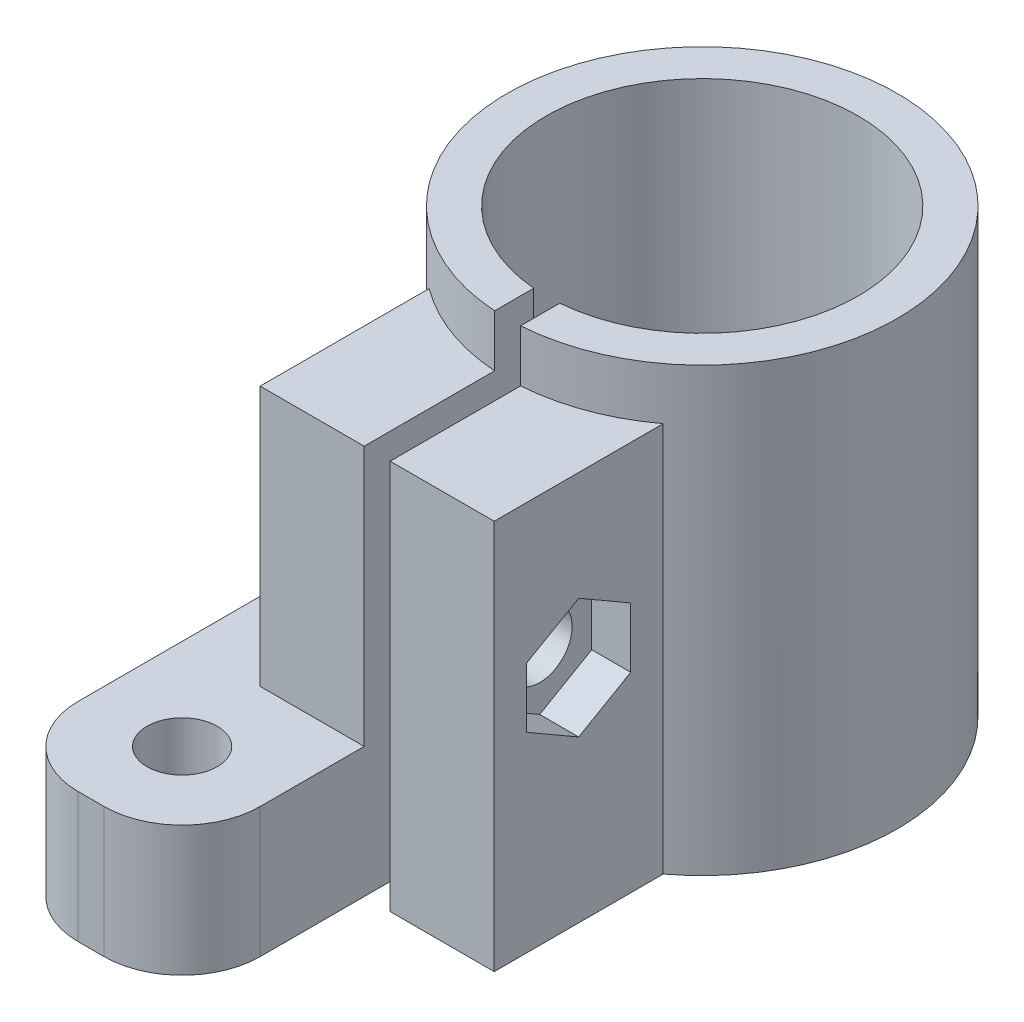
ISO-10303-21;
HEADER;
FILE_DESCRIPTION(('STEP AP214'),'2;1');
FILE_NAME('part.step','',(''),(''),'','','');
FILE_SCHEMA(('AUTOMOTIVE_DESIGN { 1 0 10303 214 1 1 1 1 }'));
ENDSEC;
DATA;
#1=APPLICATION_CONTEXT('core data for automotive mechanical design processes');
#2=APPLICATION_PROTOCOL_DEFINITION('international standard','automotive_design',2000,#1);
#3=PRODUCT_CONTEXT('',#1,'mechanical');
#4=PRODUCT('Part','Part','',(#3));
#5=PRODUCT_RELATED_PRODUCT_CATEGORY('part','',(#4));
#6=PRODUCT_DEFINITION_FORMATION('','',#4);
#7=PRODUCT_DEFINITION_CONTEXT('part definition',#1,'design');
#8=PRODUCT_DEFINITION('design','',#6,#7);
#9=PRODUCT_DEFINITION_SHAPE('','',#8);
#10=(LENGTH_UNIT() NAMED_UNIT(*) SI_UNIT(.MILLI.,.METRE.));
#11=(NAMED_UNIT(*) PLANE_ANGLE_UNIT() SI_UNIT($,.RADIAN.));
#12=(NAMED_UNIT(*) SI_UNIT($,.STERADIAN.) SOLID_ANGLE_UNIT());
#13=UNCERTAINTY_MEASURE_WITH_UNIT(LENGTH_MEASURE(1.E-05),#10,'distance_accuracy_value','');
#14=(GEOMETRIC_REPRESENTATION_CONTEXT(3) GLOBAL_UNCERTAINTY_ASSIGNED_CONTEXT((#13)) GLOBAL_UNIT_ASSIGNED_CONTEXT((#10,
#11,#12)) REPRESENTATION_CONTEXT('',''));
#15=CARTESIAN_POINT('',(0.,0.,0.));
#16=DIRECTION('',(0.,0.,1.));
#17=DIRECTION('',(1.,0.,0.));
#18=AXIS2_PLACEMENT_3D('',#15,#16,#17);
#19=CARTESIAN_POINT('',(-4.5,17.,-7.502));
#20=DIRECTION('',(-1.,0.,0.));
#21=DIRECTION('',(0.,-1.,0.));
#22=AXIS2_PLACEMENT_3D('',#19,#20,#21);
#23=PLANE('',#22);
#24=CARTESIAN_POINT('',(-4.5,8.5,9.25));
#25=DIRECTION('',(-1.,0.,0.));
#26=DIRECTION('',(0.,-1.,0.));
#27=AXIS2_PLACEMENT_3D('',#24,#25,#26);
#28=CIRCLE('',#27,1.25);
#29=CARTESIAN_POINT('',(-4.5,7.25,9.25));
#30=VERTEX_POINT('',#29);
#31=EDGE_CURVE('E274',#30,#30,#28,.T.);
#32=ORIENTED_EDGE('',*,*,#31,.F.);
#33=EDGE_LOOP('',(#32));
#34=FACE_BOUND('',#33,.T.);
#35=DIRECTION('',(0.,-1.,0.));
#36=VECTOR('',#35,1.);
#37=CARTESIAN_POINT('',(-4.5,17.,6.));
#38=LINE('',#37,#36);
#39=CARTESIAN_POINT('',(-4.5,15.,6.));
#40=VERTEX_POINT('',#39);
#41=CARTESIAN_POINT('',(-4.5,5.,6.));
#42=VERTEX_POINT('',#41);
#43=EDGE_CURVE('E313',#40,#42,#38,.T.);
#44=ORIENTED_EDGE('',*,*,#43,.T.);
#45=DIRECTION('',(0.,0.,-1.));
#46=VECTOR('',#45,1.);
#47=CARTESIAN_POINT('',(-4.5,5.,12.5));
#48=LINE('',#47,#46);
#49=CARTESIAN_POINT('',(-4.5,5.,12.5));
#50=VERTEX_POINT('',#49);
#51=EDGE_CURVE('E208',#50,#42,#48,.T.);
#52=ORIENTED_EDGE('',*,*,#51,.F.);
#53=DIRECTION('',(0.,-1.,0.));
#54=VECTOR('',#53,1.);
#55=CARTESIAN_POINT('',(-4.5,17.,12.5));
#56=LINE('',#55,#54);
#57=CARTESIAN_POINT('',(-4.5,15.,12.5));
#58=VERTEX_POINT('',#57);
#59=EDGE_CURVE('E202',#58,#50,#56,.T.);
#60=ORIENTED_EDGE('',*,*,#59,.F.);
#61=DIRECTION('',(0.,0.,1.));
#62=VECTOR('',#61,1.);
#63=CARTESIAN_POINT('',(-4.5,15.,6.));
#64=LINE('',#63,#62);
#65=EDGE_CURVE('E285',#40,#58,#64,.T.);
#66=ORIENTED_EDGE('',*,*,#65,.F.);
#67=EDGE_LOOP('',(#44,#52,#60,#66));
#68=FACE_BOUND('',#67,.T.);
#69=ADVANCED_FACE('F37',(#34,#68),#23,.T.);
#70=CARTESIAN_POINT('',(0.,0.,12.5));
#71=DIRECTION('',(0.,0.,-1.));
#72=DIRECTION('',(-1.,0.,0.));
#73=AXIS2_PLACEMENT_3D('',#70,#71,#72);
#74=PLANE('',#73);
#75=DIRECTION('',(-1.,0.,0.));
#76=VECTOR('',#75,1.);
#77=CARTESIAN_POINT('',(-0.5,5.,12.5));
#78=LINE('',#77,#76);
#79=CARTESIAN_POINT('',(-0.5,5.,12.5));
#80=VERTEX_POINT('',#79);
#81=EDGE_CURVE('E187',#80,#50,#78,.T.);
#82=ORIENTED_EDGE('',*,*,#81,.F.);
#83=DIRECTION('',(0.,1.,0.));
#84=VECTOR('',#83,1.);
#85=CARTESIAN_POINT('',(-0.5,17.,12.5));
#86=LINE('',#85,#84);
#87=CARTESIAN_POINT('',(-0.5,15.,12.5));
#88=VERTEX_POINT('',#87);
#89=EDGE_CURVE('E195',#80,#88,#86,.T.);
#90=ORIENTED_EDGE('',*,*,#89,.T.);
#91=DIRECTION('',(1.,0.,0.));
#92=VECTOR('',#91,1.);
#93=CARTESIAN_POINT('',(-4.5,15.,12.5));
#94=LINE('',#93,#92);
#95=EDGE_CURVE('E287',#58,#88,#94,.T.);
#96=ORIENTED_EDGE('',*,*,#95,.F.);
#97=ORIENTED_EDGE('',*,*,#59,.T.);
#98=EDGE_LOOP('',(#82,#90,#96,#97));
#99=FACE_BOUND('',#98,.T.);
#100=ADVANCED_FACE('F206',(#99),#74,.F.);
#101=CARTESIAN_POINT('',(0.,17.,0.));
#102=DIRECTION('',(0.,-1.,0.));
#103=DIRECTION('',(0.,0.,-1.));
#104=AXIS2_PLACEMENT_3D('',#101,#102,#103);
#105=CYLINDRICAL_SURFACE('',#104,7.5);
#106=DIRECTION('',(0.,-1.,0.));
#107=VECTOR('',#106,1.);
#108=CARTESIAN_POINT('',(-7.5,5.,0.));
#109=LINE('',#108,#107);
#110=CARTESIAN_POINT('',(-7.5,5.,0.));
#111=VERTEX_POINT('',#110);
#112=CARTESIAN_POINT('',(-7.5,0.,0.));
#113=VERTEX_POINT('',#112);
#114=EDGE_CURVE('E210',#111,#113,#109,.T.);
#115=ORIENTED_EDGE('',*,*,#114,.F.);
#116=CARTESIAN_POINT('',(0.,5.,0.));
#117=DIRECTION('',(0.,-1.,0.));
#118=DIRECTION('',(0.,0.,-1.));
#119=AXIS2_PLACEMENT_3D('',#116,#117,#118);
#120=CIRCLE('',#119,7.5);
#121=EDGE_CURVE('E222',#42,#111,#120,.T.);
#122=ORIENTED_EDGE('',*,*,#121,.F.);
#123=ORIENTED_EDGE('',*,*,#43,.F.);
#124=CARTESIAN_POINT('',(0.,15.,0.));
#125=DIRECTION('',(0.,-1.,0.));
#126=DIRECTION('',(0.,0.,1.));
#127=AXIS2_PLACEMENT_3D('',#124,#125,#126);
#128=CIRCLE('',#127,7.5);
#129=CARTESIAN_POINT('',(-0.5,15.,7.48331477354788));
#130=VERTEX_POINT('',#129);
#131=EDGE_CURVE('E281',#130,#40,#128,.T.);
#132=ORIENTED_EDGE('',*,*,#131,.F.);
#133=DIRECTION('',(0.,1.,0.));
#134=VECTOR('',#133,1.);
#135=CARTESIAN_POINT('',(-0.5,15.,7.48331477354788));
#136=LINE('',#135,#134);
#137=CARTESIAN_POINT('',(-0.5,17.,7.48331477354788));
#138=VERTEX_POINT('',#137);
#139=EDGE_CURVE('E295',#138,#130,#136,.F.);
#140=ORIENTED_EDGE('',*,*,#139,.F.);
#141=CARTESIAN_POINT('',(0.,17.,0.));
#142=DIRECTION('',(0.,1.,0.));
#143=DIRECTION('',(0.,0.,1.));
#144=AXIS2_PLACEMENT_3D('',#141,#142,#143);
#145=CIRCLE('',#144,7.5);
#146=CARTESIAN_POINT('',(0.5,17.,7.48331477354788));
#147=VERTEX_POINT('',#146);
#148=EDGE_CURVE('E341',#147,#138,#145,.T.);
#149=ORIENTED_EDGE('',*,*,#148,.F.);
#150=DIRECTION('',(0.,1.,0.));
#151=VECTOR('',#150,1.);
#152=CARTESIAN_POINT('',(0.5,15.,7.48331477354788));
#153=LINE('',#152,#151);
#154=CARTESIAN_POINT('',(0.5,15.,7.48331477354788));
#155=VERTEX_POINT('',#154);
#156=EDGE_CURVE('E297',#155,#147,#153,.T.);
#157=ORIENTED_EDGE('',*,*,#156,.F.);
#158=CARTESIAN_POINT('',(4.5,15.,6.));
#159=VERTEX_POINT('',#158);
#160=EDGE_CURVE('E282',#159,#155,#128,.T.);
#161=ORIENTED_EDGE('',*,*,#160,.F.);
#162=DIRECTION('',(0.,-1.,0.));
#163=VECTOR('',#162,1.);
#164=CARTESIAN_POINT('',(4.5,17.,6.));
#165=LINE('',#164,#163);
#166=CARTESIAN_POINT('',(4.5,0.,6.));
#167=VERTEX_POINT('',#166);
#168=EDGE_CURVE('E308',#167,#159,#165,.F.);
#169=ORIENTED_EDGE('',*,*,#168,.F.);
#170=CARTESIAN_POINT('',(0.,0.,0.));
#171=DIRECTION('',(0.,1.,0.));
#172=DIRECTION('',(0.,0.,1.));
#173=AXIS2_PLACEMENT_3D('',#170,#171,#172);
#174=CIRCLE('',#173,7.5);
#175=EDGE_CURVE('E338',#167,#113,#174,.T.);
#176=ORIENTED_EDGE('',*,*,#175,.T.);
#177=EDGE_LOOP('',(#115,#122,#123,#132,#140,#149,#157,#161,#169,#176));
#178=FACE_BOUND('',#177,.T.);
#179=ADVANCED_FACE('F373',(#178),#105,.T.);
#180=CARTESIAN_POINT('',(8.03553390593273,8.5,9.25));
#181=DIRECTION('',(-1.,0.,0.));
#182=DIRECTION('',(0.,-1.,0.));
#183=AXIS2_PLACEMENT_3D('',#180,#181,#182);
#184=CYLINDRICAL_SURFACE('',#183,1.25);
#185=CARTESIAN_POINT('',(0.5,8.5,9.25));
#186=DIRECTION('',(1.,0.,0.));
#187=DIRECTION('',(0.,0.,-1.));
#188=AXIS2_PLACEMENT_3D('',#185,#186,#187);
#189=CIRCLE('',#188,1.25);
#190=CARTESIAN_POINT('',(0.5,7.25,9.25));
#191=VERTEX_POINT('',#190);
#192=EDGE_CURVE('E278',#191,#191,#189,.T.);
#193=CARTESIAN_POINT('',(3.,8.5,9.25));
#194=DIRECTION('',(1.,0.,0.));
#195=DIRECTION('',(0.,0.,-1.));
#196=AXIS2_PLACEMENT_3D('',#193,#194,#195);
#197=CIRCLE('',#196,1.25);
#198=CARTESIAN_POINT('',(3.,7.25,9.25));
#199=VERTEX_POINT('',#198);
#200=EDGE_CURVE('E263',#199,#199,#197,.F.);
#201=CARTESIAN_POINT('',(0.5,7.25,9.25));
#202=CARTESIAN_POINT('',(0.526041666666666,7.25,9.25));
#203=CARTESIAN_POINT('',(0.552083333333333,7.25,9.25));
#204=CARTESIAN_POINT('',(0.604166666666666,7.25,9.25));
#205=CARTESIAN_POINT('',(0.630208333333333,7.25,9.25));
#206=CARTESIAN_POINT('',(0.682291666666666,7.25,9.25));
#207=CARTESIAN_POINT('',(0.708333333333333,7.25,9.25));
#208=CARTESIAN_POINT('',(0.760416666666667,7.25,9.25));
#209=CARTESIAN_POINT('',(0.786458333333333,7.25,9.25));
#210=CARTESIAN_POINT('',(0.838541666666667,7.25,9.25));
#211=CARTESIAN_POINT('',(0.864583333333333,7.25,9.25));
#212=CARTESIAN_POINT('',(0.916666666666667,7.25,9.25));
#213=CARTESIAN_POINT('',(0.942708333333333,7.25,9.25));
#214=CARTESIAN_POINT('',(0.994791666666667,7.25,9.25));
#215=CARTESIAN_POINT('',(1.02083333333333,7.25,9.25));
#216=CARTESIAN_POINT('',(1.07291666666667,7.25,9.25));
#217=CARTESIAN_POINT('',(1.09895833333333,7.25,9.25));
#218=CARTESIAN_POINT('',(1.15104166666667,7.25,9.25));
#219=CARTESIAN_POINT('',(1.17708333333333,7.25,9.25));
#220=CARTESIAN_POINT('',(1.22916666666667,7.25,9.25));
#221=CARTESIAN_POINT('',(1.25520833333333,7.25,9.25));
#222=CARTESIAN_POINT('',(1.30729166666667,7.25,9.25));
#223=CARTESIAN_POINT('',(1.33333333333333,7.25,9.25));
#224=CARTESIAN_POINT('',(1.38541666666667,7.25,9.25));
#225=CARTESIAN_POINT('',(1.41145833333333,7.25,9.25));
#226=CARTESIAN_POINT('',(1.46354166666667,7.25,9.25));
#227=CARTESIAN_POINT('',(1.48958333333333,7.25,9.25));
#228=CARTESIAN_POINT('',(1.54166666666667,7.25,9.25));
#229=CARTESIAN_POINT('',(1.56770833333333,7.25,9.25));
#230=CARTESIAN_POINT('',(1.61979166666667,7.25,9.25));
#231=CARTESIAN_POINT('',(1.64583333333333,7.25,9.25));
#232=CARTESIAN_POINT('',(1.69791666666667,7.25,9.25));
#233=CARTESIAN_POINT('',(1.72395833333333,7.25,9.25));
#234=CARTESIAN_POINT('',(1.77604166666667,7.25,9.25));
#235=CARTESIAN_POINT('',(1.80208333333333,7.25,9.25));
#236=CARTESIAN_POINT('',(1.85416666666667,7.25,9.25));
#237=CARTESIAN_POINT('',(1.88020833333333,7.25,9.25));
#238=CARTESIAN_POINT('',(1.93229166666667,7.25,9.25));
#239=CARTESIAN_POINT('',(1.95833333333333,7.25,9.25));
#240=CARTESIAN_POINT('',(2.01041666666667,7.25,9.25));
#241=CARTESIAN_POINT('',(2.03645833333333,7.25,9.25));
#242=CARTESIAN_POINT('',(2.08854166666667,7.25,9.25));
#243=CARTESIAN_POINT('',(2.11458333333333,7.25,9.25));
#244=CARTESIAN_POINT('',(2.16666666666667,7.25,9.25));
#245=CARTESIAN_POINT('',(2.19270833333333,7.25,9.25));
#246=CARTESIAN_POINT('',(2.24479166666667,7.25,9.25));
#247=CARTESIAN_POINT('',(2.27083333333333,7.25,9.25));
#248=CARTESIAN_POINT('',(2.32291666666667,7.25,9.25));
#249=CARTESIAN_POINT('',(2.34895833333333,7.25,9.25));
#250=CARTESIAN_POINT('',(2.40104166666667,7.25,9.25));
#251=CARTESIAN_POINT('',(2.42708333333333,7.25,9.25));
#252=CARTESIAN_POINT('',(2.47916666666667,7.25,9.25));
#253=CARTESIAN_POINT('',(2.50520833333333,7.25,9.25));
#254=CARTESIAN_POINT('',(2.55729166666667,7.25,9.25));
#255=CARTESIAN_POINT('',(2.58333333333333,7.25,9.25));
#256=CARTESIAN_POINT('',(2.63541666666667,7.25,9.25));
#257=CARTESIAN_POINT('',(2.66145833333333,7.25,9.25));
#258=CARTESIAN_POINT('',(2.71354166666667,7.25,9.25));
#259=CARTESIAN_POINT('',(2.73958333333333,7.25,9.25));
#260=CARTESIAN_POINT('',(2.79166666666667,7.25,9.25));
#261=CARTESIAN_POINT('',(2.81770833333333,7.25,9.25));
#262=CARTESIAN_POINT('',(2.86979166666667,7.25,9.25));
#263=CARTESIAN_POINT('',(2.89583333333333,7.25,9.25));
#264=CARTESIAN_POINT('',(2.94791666666667,7.25,9.25));
#265=CARTESIAN_POINT('',(2.97395833333333,7.25,9.25));
#266=CARTESIAN_POINT('',(3.,7.25,9.25));
#267=B_SPLINE_CURVE_WITH_KNOTS('',3,(#201,#202,#203,#204,#205,#206,#207,#208,#209,#210,#211,
#212,#213,#214,#215,#216,#217,#218,#219,#220,#221,#222,#223,#224,#225,#226,#227,#228,#229,#230,
#231,#232,#233,#234,#235,#236,#237,#238,#239,#240,#241,#242,#243,#244,#245,#246,#247,#248,#249,
#250,#251,#252,#253,#254,#255,#256,#257,#258,#259,#260,#261,#262,#263,#264,#265,#266),
.UNSPECIFIED.,.F.,.F.,(4,2,2,2,2,2,2,2,2,2,2,2,2,2,2,2,2,2,2,2,2,2,2,2,2,2,2,2,2,2,2,2,4),(0.,
0.0781250000000001,0.15625,0.234375,0.3125,0.390625,0.46875,0.546875,0.625000000000001,
0.703125000000001,0.78125,0.859375,0.9375,1.015625,1.09375,1.171875,1.25,1.328125,1.40625,
1.484375,1.5625,1.640625,1.71875,1.796875,1.875,1.953125,2.03125,2.109375,2.1875,2.265625,
2.34375,2.421875,2.5),.UNSPECIFIED.);
#268=EDGE_CURVE('BSEAM435',#191,#199,#267,.T.);
#269=ORIENTED_EDGE('',*,*,#192,.F.);
#270=ORIENTED_EDGE('',*,*,#200,.F.);
#271=ORIENTED_EDGE('',*,*,#268,.T.);
#272=ORIENTED_EDGE('',*,*,#268,.F.);
#273=EDGE_LOOP('',(#269,#271,#270,#272));
#274=FACE_BOUND('',#273,.T.);
#275=ADVANCED_FACE('F435',(#274),#184,.F.);
#276=CARTESIAN_POINT('',(4.5,17.,-7.502));
#277=DIRECTION('',(1.,0.,0.));
#278=DIRECTION('',(0.,1.,0.));
#279=AXIS2_PLACEMENT_3D('',#276,#277,#278);
#280=PLANE('',#279);
#281=DIRECTION('',(0.,-0.5,-0.866025403784439));
#282=VECTOR('',#281,1.);
#283=CARTESIAN_POINT('',(4.5,7.34529946162075,11.25));
#284=LINE('',#283,#282);
#285=CARTESIAN_POINT('',(4.5,7.34529946162075,11.25));
#286=VERTEX_POINT('',#285);
#287=CARTESIAN_POINT('',(4.5,6.1905989232415,9.25));
#288=VERTEX_POINT('',#287);
#289=EDGE_CURVE('E225',#286,#288,#284,.T.);
#290=ORIENTED_EDGE('',*,*,#289,.F.);
#291=DIRECTION('',(0.,-1.,0.));
#292=VECTOR('',#291,1.);
#293=CARTESIAN_POINT('',(4.5,9.65470053837926,11.25));
#294=LINE('',#293,#292);
#295=CARTESIAN_POINT('',(4.5,9.65470053837926,11.25));
#296=VERTEX_POINT('',#295);
#297=EDGE_CURVE('E230',#296,#286,#294,.T.);
#298=ORIENTED_EDGE('',*,*,#297,.F.);
#299=DIRECTION('',(0.,-0.5,0.866025403784438));
#300=VECTOR('',#299,1.);
#301=CARTESIAN_POINT('',(4.5,10.8094010767585,9.25));
#302=LINE('',#301,#300);
#303=CARTESIAN_POINT('',(4.5,10.8094010767585,9.25));
#304=VERTEX_POINT('',#303);
#305=EDGE_CURVE('E256',#304,#296,#302,.T.);
#306=ORIENTED_EDGE('',*,*,#305,.F.);
#307=DIRECTION('',(0.,0.499999999999999,0.866025403784439));
#308=VECTOR('',#307,1.);
#309=CARTESIAN_POINT('',(4.5,9.65470053837926,7.25));
#310=LINE('',#309,#308);
#311=CARTESIAN_POINT('',(4.5,9.65470053837926,7.25));
#312=VERTEX_POINT('',#311);
#313=EDGE_CURVE('E253',#312,#304,#310,.T.);
#314=ORIENTED_EDGE('',*,*,#313,.F.);
#315=DIRECTION('',(0.,1.,0.));
#316=VECTOR('',#315,1.);
#317=CARTESIAN_POINT('',(4.5,7.34529946162075,7.25));
#318=LINE('',#317,#316);
#319=CARTESIAN_POINT('',(4.5,7.34529946162075,7.25));
#320=VERTEX_POINT('',#319);
#321=EDGE_CURVE('E250',#320,#312,#318,.T.);
#322=ORIENTED_EDGE('',*,*,#321,.F.);
#323=DIRECTION('',(0.,0.5,-0.866025403784438));
#324=VECTOR('',#323,1.);
#325=CARTESIAN_POINT('',(4.5,6.1905989232415,9.25));
#326=LINE('',#325,#324);
#327=EDGE_CURVE('E247',#288,#320,#326,.T.);
#328=ORIENTED_EDGE('',*,*,#327,.F.);
#329=EDGE_LOOP('',(#290,#298,#306,#314,#322,#328));
#330=FACE_BOUND('',#329,.T.);
#331=ORIENTED_EDGE('',*,*,#168,.T.);
#332=DIRECTION('',(0.,0.,-1.));
#333=VECTOR('',#332,1.);
#334=CARTESIAN_POINT('',(4.5,15.,12.5));
#335=LINE('',#334,#333);
#336=CARTESIAN_POINT('',(4.5,15.,12.5));
#337=VERTEX_POINT('',#336);
#338=EDGE_CURVE('E289',#337,#159,#335,.T.);
#339=ORIENTED_EDGE('',*,*,#338,.F.);
#340=DIRECTION('',(0.,1.,0.));
#341=VECTOR('',#340,1.);
#342=CARTESIAN_POINT('',(4.5,17.,12.5));
#343=LINE('',#342,#341);
#344=CARTESIAN_POINT('',(4.5,0.,12.5));
#345=VERTEX_POINT('',#344);
#346=EDGE_CURVE('E305',#345,#337,#343,.T.);
#347=ORIENTED_EDGE('',*,*,#346,.F.);
#348=DIRECTION('',(0.,0.,1.));
#349=VECTOR('',#348,1.);
#350=CARTESIAN_POINT('',(4.5,0.,-7.502));
#351=LINE('',#350,#349);
#352=EDGE_CURVE('E203',#167,#345,#351,.T.);
#353=ORIENTED_EDGE('',*,*,#352,.F.);
#354=EDGE_LOOP('',(#331,#339,#347,#353));
#355=FACE_BOUND('',#354,.T.);
#356=ADVANCED_FACE('F399',(#330,#355),#280,.T.);
#357=CARTESIAN_POINT('',(0.,0.,12.5));
#358=DIRECTION('',(0.,0.,1.));
#359=DIRECTION('',(1.,0.,0.));
#360=AXIS2_PLACEMENT_3D('',#357,#358,#359);
#361=PLANE('',#360);
#362=ORIENTED_EDGE('',*,*,#346,.T.);
#363=DIRECTION('',(-1.,0.,0.));
#364=VECTOR('',#363,1.);
#365=CARTESIAN_POINT('',(0.,15.,12.5));
#366=LINE('',#365,#364);
#367=CARTESIAN_POINT('',(0.5,15.,12.5));
#368=VERTEX_POINT('',#367);
#369=EDGE_CURVE('E343',#337,#368,#366,.T.);
#370=ORIENTED_EDGE('',*,*,#369,.T.);
#371=DIRECTION('',(0.,-1.,0.));
#372=VECTOR('',#371,1.);
#373=CARTESIAN_POINT('',(0.5,17.,12.5));
#374=LINE('',#373,#372);
#375=CARTESIAN_POINT('',(0.5,0.,12.5));
#376=VERTEX_POINT('',#375);
#377=EDGE_CURVE('E300',#368,#376,#374,.T.);
#378=ORIENTED_EDGE('',*,*,#377,.T.);
#379=DIRECTION('',(1.,0.,0.));
#380=VECTOR('',#379,1.);
#381=CARTESIAN_POINT('',(0.5,0.,12.5));
#382=LINE('',#381,#380);
#383=EDGE_CURVE('E302',#376,#345,#382,.T.);
#384=ORIENTED_EDGE('',*,*,#383,.T.);
#385=EDGE_LOOP('',(#362,#370,#378,#384));
#386=FACE_BOUND('',#385,.T.);
#387=ADVANCED_FACE('F396',(#386),#361,.T.);
#388=CARTESIAN_POINT('',(0.,17.,0.));
#389=DIRECTION('',(0.,1.,0.));
#390=DIRECTION('',(0.,0.,1.));
#391=AXIS2_PLACEMENT_3D('',#388,#389,#390);
#392=PLANE('',#391);
#393=ORIENTED_EDGE('',*,*,#148,.T.);
#394=DIRECTION('',(0.,0.,1.));
#395=VECTOR('',#394,1.);
#396=CARTESIAN_POINT('',(-0.5,17.,-7.501));
#397=LINE('',#396,#395);
#398=CARTESIAN_POINT('',(-0.5,17.,5.9791303715507));
#399=VERTEX_POINT('',#398);
#400=EDGE_CURVE('E330',#399,#138,#397,.T.);
#401=ORIENTED_EDGE('',*,*,#400,.F.);
#402=CARTESIAN_POINT('',(0.,17.,0.));
#403=DIRECTION('',(0.,1.,0.));
#404=DIRECTION('',(0.,0.,1.));
#405=AXIS2_PLACEMENT_3D('',#402,#403,#404);
#406=CIRCLE('',#405,6.);
#407=CARTESIAN_POINT('',(0.5,17.,5.9791303715507));
#408=VERTEX_POINT('',#407);
#409=EDGE_CURVE('E335',#408,#399,#406,.T.);
#410=ORIENTED_EDGE('',*,*,#409,.F.);
#411=DIRECTION('',(0.,0.,1.));
#412=VECTOR('',#411,1.);
#413=CARTESIAN_POINT('',(0.5,17.,-7.501));
#414=LINE('',#413,#412);
#415=EDGE_CURVE('E322',#408,#147,#414,.T.);
#416=ORIENTED_EDGE('',*,*,#415,.T.);
#417=EDGE_LOOP('',(#393,#401,#410,#416));
#418=FACE_BOUND('',#417,.T.);
#419=ADVANCED_FACE('F384',(#418),#392,.T.);
#420=CARTESIAN_POINT('',(0.,0.,0.));
#421=DIRECTION('',(0.,1.,0.));
#422=DIRECTION('',(0.,0.,1.));
#423=AXIS2_PLACEMENT_3D('',#420,#421,#422);
#424=PLANE('',#423);
#425=CARTESIAN_POINT('',(-4.,0.,16.));
#426=DIRECTION('',(0.,1.,0.));
#427=DIRECTION('',(0.,0.,1.));
#428=AXIS2_PLACEMENT_3D('',#425,#426,#427);
#429=CIRCLE('',#428,1.35);
#430=CARTESIAN_POINT('',(-4.,0.,17.35));
#431=VERTEX_POINT('',#430);
#432=EDGE_CURVE('E217',#431,#431,#429,.F.);
#433=ORIENTED_EDGE('',*,*,#432,.F.);
#434=EDGE_LOOP('',(#433));
#435=FACE_BOUND('',#434,.T.);
#436=DIRECTION('',(0.,0.,1.));
#437=VECTOR('',#436,1.);
#438=CARTESIAN_POINT('',(-0.5,0.,-7.501));
#439=LINE('',#438,#437);
#440=CARTESIAN_POINT('',(-0.5,0.,5.9791303715507));
#441=VERTEX_POINT('',#440);
#442=CARTESIAN_POINT('',(-0.5,0.,16.5));
#443=VERTEX_POINT('',#442);
#444=EDGE_CURVE('E327',#441,#443,#439,.T.);
#445=ORIENTED_EDGE('',*,*,#444,.T.);
#446=CARTESIAN_POINT('',(-3.5,0.,16.5));
#447=DIRECTION('',(0.,1.,0.));
#448=DIRECTION('',(0.,0.,1.));
#449=AXIS2_PLACEMENT_3D('',#446,#447,#448);
#450=CIRCLE('',#449,3.);
#451=CARTESIAN_POINT('',(-3.5,0.,19.5));
#452=VERTEX_POINT('',#451);
#453=EDGE_CURVE('E355',#443,#452,#450,.F.);
#454=ORIENTED_EDGE('',*,*,#453,.T.);
#455=DIRECTION('',(1.,0.,0.));
#456=VECTOR('',#455,1.);
#457=CARTESIAN_POINT('',(-7.5,0.,19.5));
#458=LINE('',#457,#456);
#459=CARTESIAN_POINT('',(-4.5,0.,19.5));
#460=VERTEX_POINT('',#459);
#461=EDGE_CURVE('E216',#460,#452,#458,.T.);
#462=ORIENTED_EDGE('',*,*,#461,.F.);
#463=CARTESIAN_POINT('',(-4.5,0.,16.5));
#464=DIRECTION('',(0.,1.,0.));
#465=DIRECTION('',(0.,0.,1.));
#466=AXIS2_PLACEMENT_3D('',#463,#464,#465);
#467=CIRCLE('',#466,3.);
#468=CARTESIAN_POINT('',(-7.5,0.,16.5));
#469=VERTEX_POINT('',#468);
#470=EDGE_CURVE('E353',#460,#469,#467,.F.);
#471=ORIENTED_EDGE('',*,*,#470,.T.);
#472=DIRECTION('',(0.,0.,1.));
#473=VECTOR('',#472,1.);
#474=CARTESIAN_POINT('',(-7.5,0.,0.));
#475=LINE('',#474,#473);
#476=EDGE_CURVE('E214',#113,#469,#475,.T.);
#477=ORIENTED_EDGE('',*,*,#476,.F.);
#478=ORIENTED_EDGE('',*,*,#175,.F.);
#479=ORIENTED_EDGE('',*,*,#352,.T.);
#480=ORIENTED_EDGE('',*,*,#383,.F.);
#481=DIRECTION('',(0.,0.,1.));
#482=VECTOR('',#481,1.);
#483=CARTESIAN_POINT('',(0.5,0.,-7.501));
#484=LINE('',#483,#482);
#485=CARTESIAN_POINT('',(0.5,0.,5.9791303715507));
#486=VERTEX_POINT('',#485);
#487=EDGE_CURVE('E323',#486,#376,#484,.T.);
#488=ORIENTED_EDGE('',*,*,#487,.F.);
#489=CARTESIAN_POINT('',(0.,0.,0.));
#490=DIRECTION('',(0.,1.,0.));
#491=DIRECTION('',(0.,0.,1.));
#492=AXIS2_PLACEMENT_3D('',#489,#490,#491);
#493=CIRCLE('',#492,6.);
#494=EDGE_CURVE('E326',#486,#441,#493,.T.);
#495=ORIENTED_EDGE('',*,*,#494,.T.);
#496=EDGE_LOOP('',(#445,#454,#462,#471,#477,#478,#479,#480,#488,#495));
#497=FACE_BOUND('',#496,.T.);
#498=ADVANCED_FACE('F369',(#435,#497),#424,.F.);
#499=CARTESIAN_POINT('',(0.,17.,0.));
#500=DIRECTION('',(0.,-1.,0.));
#501=DIRECTION('',(0.,0.,-1.));
#502=AXIS2_PLACEMENT_3D('',#499,#500,#501);
#503=CYLINDRICAL_SURFACE('',#502,6.);
#504=DIRECTION('',(0.,-1.,0.));
#505=VECTOR('',#504,1.);
#506=CARTESIAN_POINT('',(-0.5,17.,5.9791303715507));
#507=LINE('',#506,#505);
#508=EDGE_CURVE('E316',#399,#441,#507,.T.);
#509=ORIENTED_EDGE('',*,*,#508,.T.);
#510=ORIENTED_EDGE('',*,*,#494,.F.);
#511=DIRECTION('',(0.,-1.,0.));
#512=VECTOR('',#511,1.);
#513=CARTESIAN_POINT('',(0.5,17.,5.9791303715507));
#514=LINE('',#513,#512);
#515=EDGE_CURVE('E319',#486,#408,#514,.F.);
#516=ORIENTED_EDGE('',*,*,#515,.T.);
#517=ORIENTED_EDGE('',*,*,#409,.T.);
#518=EDGE_LOOP('',(#509,#510,#516,#517));
#519=FACE_BOUND('',#518,.T.);
#520=ADVANCED_FACE('F386',(#519),#503,.F.);
#521=CARTESIAN_POINT('',(0.5,17.,-7.501));
#522=DIRECTION('',(1.,0.,0.));
#523=DIRECTION('',(0.,0.,-1.));
#524=AXIS2_PLACEMENT_3D('',#521,#522,#523);
#525=PLANE('',#524);
#526=ORIENTED_EDGE('',*,*,#192,.T.);
#527=EDGE_LOOP('',(#526));
#528=FACE_BOUND('',#527,.T.);
#529=DIRECTION('',(0.,0.,1.));
#530=VECTOR('',#529,1.);
#531=CARTESIAN_POINT('',(0.5,15.,-7.501));
#532=LINE('',#531,#530);
#533=EDGE_CURVE('E293',#155,#368,#532,.T.);
#534=ORIENTED_EDGE('',*,*,#533,.F.);
#535=ORIENTED_EDGE('',*,*,#156,.T.);
#536=ORIENTED_EDGE('',*,*,#415,.F.);
#537=ORIENTED_EDGE('',*,*,#515,.F.);
#538=ORIENTED_EDGE('',*,*,#487,.T.);
#539=ORIENTED_EDGE('',*,*,#377,.F.);
#540=EDGE_LOOP('',(#534,#535,#536,#537,#538,#539));
#541=FACE_BOUND('',#540,.T.);
#542=ADVANCED_FACE('F391',(#528,#541),#525,.F.);
#543=CARTESIAN_POINT('',(-0.5,17.,-7.501));
#544=DIRECTION('',(-1.,0.,0.));
#545=DIRECTION('',(0.,0.,1.));
#546=AXIS2_PLACEMENT_3D('',#543,#544,#545);
#547=PLANE('',#546);
#548=CARTESIAN_POINT('',(-0.5,8.5,9.25));
#549=DIRECTION('',(-1.,0.,0.));
#550=DIRECTION('',(0.,0.,1.));
#551=AXIS2_PLACEMENT_3D('',#548,#549,#550);
#552=CIRCLE('',#551,1.25);
#553=CARTESIAN_POINT('',(-0.499999999999999,7.25,9.25));
#554=VERTEX_POINT('',#553);
#555=EDGE_CURVE('E277',#554,#554,#552,.T.);
#556=ORIENTED_EDGE('',*,*,#555,.T.);
#557=EDGE_LOOP('',(#556));
#558=FACE_BOUND('',#557,.T.);
#559=DIRECTION('',(0.,0.,-1.));
#560=VECTOR('',#559,1.);
#561=CARTESIAN_POINT('',(-0.5,5.,19.5));
#562=LINE('',#561,#560);
#563=CARTESIAN_POINT('',(-0.5,5.,16.5));
#564=VERTEX_POINT('',#563);
#565=EDGE_CURVE('E182',#564,#80,#562,.T.);
#566=ORIENTED_EDGE('',*,*,#565,.F.);
#567=DIRECTION('',(0.,-1.,0.));
#568=VECTOR('',#567,1.);
#569=CARTESIAN_POINT('',(-0.5,17.,16.5));
#570=LINE('',#569,#568);
#571=EDGE_CURVE('E347',#564,#443,#570,.T.);
#572=ORIENTED_EDGE('',*,*,#571,.T.);
#573=ORIENTED_EDGE('',*,*,#444,.F.);
#574=ORIENTED_EDGE('',*,*,#508,.F.);
#575=ORIENTED_EDGE('',*,*,#400,.T.);
#576=ORIENTED_EDGE('',*,*,#139,.T.);
#577=DIRECTION('',(0.,0.,-1.));
#578=VECTOR('',#577,1.);
#579=CARTESIAN_POINT('',(-0.5,15.,-7.501));
#580=LINE('',#579,#578);
#581=EDGE_CURVE('E198',#88,#130,#580,.T.);
#582=ORIENTED_EDGE('',*,*,#581,.F.);
#583=ORIENTED_EDGE('',*,*,#89,.F.);
#584=EDGE_LOOP('',(#566,#572,#573,#574,#575,#576,#582,#583));
#585=FACE_BOUND('',#584,.T.);
#586=ADVANCED_FACE('F196',(#558,#585),#547,.F.);
#587=CARTESIAN_POINT('',(0.,15.,0.));
#588=DIRECTION('',(0.,1.,0.));
#589=DIRECTION('',(0.,0.,1.));
#590=AXIS2_PLACEMENT_3D('',#587,#588,#589);
#591=PLANE('',#590);
#592=ORIENTED_EDGE('',*,*,#533,.T.);
#593=ORIENTED_EDGE('',*,*,#369,.F.);
#594=ORIENTED_EDGE('',*,*,#338,.T.);
#595=ORIENTED_EDGE('',*,*,#160,.T.);
#596=EDGE_LOOP('',(#592,#593,#594,#595));
#597=FACE_BOUND('',#596,.T.);
#598=ADVANCED_FACE('F401',(#597),#591,.T.);
#599=ORIENTED_EDGE('',*,*,#581,.T.);
#600=ORIENTED_EDGE('',*,*,#131,.T.);
#601=ORIENTED_EDGE('',*,*,#65,.T.);
#602=ORIENTED_EDGE('',*,*,#95,.T.);
#603=EDGE_LOOP('',(#599,#600,#601,#602));
#604=FACE_BOUND('',#603,.T.);
#605=ADVANCED_FACE('F403',(#604),#591,.T.);
#606=CARTESIAN_POINT('',(-4.5,7.25,9.25));
#607=CARTESIAN_POINT('',(-4.45833333333333,7.25,9.25));
#608=CARTESIAN_POINT('',(-4.41666666666667,7.25,9.25));
#609=CARTESIAN_POINT('',(-4.33333333333333,7.25,9.25));
#610=CARTESIAN_POINT('',(-4.29166666666667,7.25,9.25));
#611=CARTESIAN_POINT('',(-4.20833333333333,7.25,9.25));
#612=CARTESIAN_POINT('',(-4.16666666666667,7.25,9.25));
#613=CARTESIAN_POINT('',(-4.08333333333333,7.25,9.25));
#614=CARTESIAN_POINT('',(-4.04166666666667,7.25,9.25));
#615=CARTESIAN_POINT('',(-3.95833333333333,7.25,9.25));
#616=CARTESIAN_POINT('',(-3.91666666666666,7.25,9.25));
#617=CARTESIAN_POINT('',(-3.83333333333333,7.25,9.25));
#618=CARTESIAN_POINT('',(-3.79166666666667,7.25,9.25));
#619=CARTESIAN_POINT('',(-3.70833333333333,7.25,9.25));
#620=CARTESIAN_POINT('',(-3.66666666666666,7.25,9.25));
#621=CARTESIAN_POINT('',(-3.58333333333333,7.25,9.25));
#622=CARTESIAN_POINT('',(-3.54166666666666,7.25,9.25));
#623=CARTESIAN_POINT('',(-3.45833333333333,7.25,9.25));
#624=CARTESIAN_POINT('',(-3.41666666666666,7.25,9.25));
#625=CARTESIAN_POINT('',(-3.33333333333333,7.25,9.25));
#626=CARTESIAN_POINT('',(-3.29166666666667,7.25,9.25));
#627=CARTESIAN_POINT('',(-3.20833333333333,7.25,9.25));
#628=CARTESIAN_POINT('',(-3.16666666666667,7.25,9.25));
#629=CARTESIAN_POINT('',(-3.08333333333333,7.25,9.25));
#630=CARTESIAN_POINT('',(-3.04166666666667,7.25,9.25));
#631=CARTESIAN_POINT('',(-2.95833333333333,7.25,9.25));
#632=CARTESIAN_POINT('',(-2.91666666666667,7.25,9.25));
#633=CARTESIAN_POINT('',(-2.83333333333333,7.25,9.25));
#634=CARTESIAN_POINT('',(-2.79166666666667,7.25,9.25));
#635=CARTESIAN_POINT('',(-2.70833333333333,7.25,9.25));
#636=CARTESIAN_POINT('',(-2.66666666666667,7.25,9.25));
#637=CARTESIAN_POINT('',(-2.58333333333333,7.25,9.25));
#638=CARTESIAN_POINT('',(-2.54166666666667,7.25,9.25));
#639=CARTESIAN_POINT('',(-2.45833333333333,7.25,9.25));
#640=CARTESIAN_POINT('',(-2.41666666666667,7.25,9.25));
#641=CARTESIAN_POINT('',(-2.33333333333333,7.25,9.25));
#642=CARTESIAN_POINT('',(-2.29166666666667,7.25,9.25));
#643=CARTESIAN_POINT('',(-2.20833333333333,7.25,9.25));
#644=CARTESIAN_POINT('',(-2.16666666666667,7.25,9.25));
#645=CARTESIAN_POINT('',(-2.08333333333333,7.25,9.25));
#646=CARTESIAN_POINT('',(-2.04166666666667,7.25,9.25));
#647=CARTESIAN_POINT('',(-1.95833333333333,7.25,9.25));
#648=CARTESIAN_POINT('',(-1.91666666666666,7.25,9.25));
#649=CARTESIAN_POINT('',(-1.83333333333333,7.25,9.25));
#650=CARTESIAN_POINT('',(-1.79166666666667,7.25,9.25));
#651=CARTESIAN_POINT('',(-1.70833333333333,7.25,9.25));
#652=CARTESIAN_POINT('',(-1.66666666666667,7.25,9.25));
#653=CARTESIAN_POINT('',(-1.58333333333333,7.25,9.25));
#654=CARTESIAN_POINT('',(-1.54166666666667,7.25,9.25));
#655=CARTESIAN_POINT('',(-1.45833333333333,7.25,9.25));
#656=CARTESIAN_POINT('',(-1.41666666666667,7.25,9.25));
#657=CARTESIAN_POINT('',(-1.33333333333333,7.25,9.25));
#658=CARTESIAN_POINT('',(-1.29166666666667,7.25,9.25));
#659=CARTESIAN_POINT('',(-1.20833333333333,7.25,9.25));
#660=CARTESIAN_POINT('',(-1.16666666666667,7.25,9.25));
#661=CARTESIAN_POINT('',(-1.08333333333333,7.25,9.25));
#662=CARTESIAN_POINT('',(-1.04166666666667,7.25,9.25));
#663=CARTESIAN_POINT('',(-0.958333333333332,7.25,9.25));
#664=CARTESIAN_POINT('',(-0.916666666666666,7.25,9.25));
#665=CARTESIAN_POINT('',(-0.833333333333332,7.25,9.25));
#666=CARTESIAN_POINT('',(-0.791666666666666,7.25,9.25));
#667=CARTESIAN_POINT('',(-0.708333333333332,7.25,9.25));
#668=CARTESIAN_POINT('',(-0.666666666666666,7.25,9.25));
#669=CARTESIAN_POINT('',(-0.583333333333332,7.25,9.25));
#670=CARTESIAN_POINT('',(-0.541666666666665,7.25,9.25));
#671=CARTESIAN_POINT('',(-0.499999999999999,7.25,9.25));
#672=B_SPLINE_CURVE_WITH_KNOTS('',3,(#606,#607,#608,#609,#610,#611,#612,#613,#614,#615,#616,
#617,#618,#619,#620,#621,#622,#623,#624,#625,#626,#627,#628,#629,#630,#631,#632,#633,#634,#635,
#636,#637,#638,#639,#640,#641,#642,#643,#644,#645,#646,#647,#648,#649,#650,#651,#652,#653,#654,
#655,#656,#657,#658,#659,#660,#661,#662,#663,#664,#665,#666,#667,#668,#669,#670,#671),
.UNSPECIFIED.,.F.,.F.,(4,2,2,2,2,2,2,2,2,2,2,2,2,2,2,2,2,2,2,2,2,2,2,2,2,2,2,2,2,2,2,2,4),(0.,
0.125,0.25,0.375,0.5,0.625000000000001,0.750000000000001,0.875000000000001,1.,1.125,1.25,1.375,
1.5,1.625,1.75,1.875,2.,2.125,2.25,2.375,2.5,2.625,2.75,2.875,3.,3.125,3.25,3.375,3.5,3.625,
3.75,3.875,4.),.UNSPECIFIED.);
#673=EDGE_CURVE('BSEAM409',#30,#554,#672,.T.);
#674=ORIENTED_EDGE('',*,*,#31,.T.);
#675=ORIENTED_EDGE('',*,*,#555,.F.);
#676=ORIENTED_EDGE('',*,*,#673,.T.);
#677=ORIENTED_EDGE('',*,*,#673,.F.);
#678=EDGE_LOOP('',(#674,#676,#675,#677));
#679=FACE_BOUND('',#678,.T.);
#680=ADVANCED_FACE('F409',(#679),#184,.F.);
#681=CARTESIAN_POINT('',(3.,0.,0.));
#682=DIRECTION('',(1.,0.,0.));
#683=DIRECTION('',(0.,0.,-1.));
#684=AXIS2_PLACEMENT_3D('',#681,#682,#683);
#685=PLANE('',#684);
#686=DIRECTION('',(0.,-0.5,-0.866025403784439));
#687=VECTOR('',#686,1.);
#688=CARTESIAN_POINT('',(3.,7.34529946162075,11.25));
#689=LINE('',#688,#687);
#690=CARTESIAN_POINT('',(3.,7.34529946162075,11.25));
#691=VERTEX_POINT('',#690);
#692=CARTESIAN_POINT('',(3.,6.1905989232415,9.25));
#693=VERTEX_POINT('',#692);
#694=EDGE_CURVE('E226',#691,#693,#689,.T.);
#695=ORIENTED_EDGE('',*,*,#694,.T.);
#696=DIRECTION('',(0.,0.5,-0.866025403784438));
#697=VECTOR('',#696,1.);
#698=CARTESIAN_POINT('',(3.,6.1905989232415,9.25));
#699=LINE('',#698,#697);
#700=CARTESIAN_POINT('',(3.,7.34529946162075,7.25));
#701=VERTEX_POINT('',#700);
#702=EDGE_CURVE('E229',#693,#701,#699,.T.);
#703=ORIENTED_EDGE('',*,*,#702,.T.);
#704=DIRECTION('',(0.,1.,0.));
#705=VECTOR('',#704,1.);
#706=CARTESIAN_POINT('',(3.,7.34529946162075,7.25));
#707=LINE('',#706,#705);
#708=CARTESIAN_POINT('',(3.,9.65470053837926,7.25));
#709=VERTEX_POINT('',#708);
#710=EDGE_CURVE('E233',#701,#709,#707,.T.);
#711=ORIENTED_EDGE('',*,*,#710,.T.);
#712=DIRECTION('',(0.,0.499999999999999,0.866025403784439));
#713=VECTOR('',#712,1.);
#714=CARTESIAN_POINT('',(3.,9.65470053837926,7.25));
#715=LINE('',#714,#713);
#716=CARTESIAN_POINT('',(3.,10.8094010767585,9.25));
#717=VERTEX_POINT('',#716);
#718=EDGE_CURVE('E236',#709,#717,#715,.T.);
#719=ORIENTED_EDGE('',*,*,#718,.T.);
#720=DIRECTION('',(0.,-0.5,0.866025403784438));
#721=VECTOR('',#720,1.);
#722=CARTESIAN_POINT('',(3.,10.8094010767585,9.25));
#723=LINE('',#722,#721);
#724=CARTESIAN_POINT('',(3.,9.65470053837926,11.25));
#725=VERTEX_POINT('',#724);
#726=EDGE_CURVE('E239',#717,#725,#723,.T.);
#727=ORIENTED_EDGE('',*,*,#726,.T.);
#728=DIRECTION('',(0.,-1.,0.));
#729=VECTOR('',#728,1.);
#730=CARTESIAN_POINT('',(3.,9.65470053837926,11.25));
#731=LINE('',#730,#729);
#732=EDGE_CURVE('E242',#725,#691,#731,.T.);
#733=ORIENTED_EDGE('',*,*,#732,.T.);
#734=EDGE_LOOP('',(#695,#703,#711,#719,#727,#733));
#735=FACE_BOUND('',#734,.T.);
#736=ORIENTED_EDGE('',*,*,#200,.T.);
#737=EDGE_LOOP('',(#736));
#738=FACE_BOUND('',#737,.T.);
#739=ADVANCED_FACE('F459',(#735,#738),#685,.T.);
#740=CARTESIAN_POINT('',(3.,7.34529946162075,11.25));
#741=DIRECTION('',(0.,-0.866025403784439,0.5));
#742=DIRECTION('',(0.,-0.5,-0.866025403784439));
#743=AXIS2_PLACEMENT_3D('',#740,#741,#742);
#744=PLANE('',#743);
#745=ORIENTED_EDGE('',*,*,#289,.T.);
#746=DIRECTION('',(1.,0.,0.));
#747=VECTOR('',#746,1.);
#748=CARTESIAN_POINT('',(3.,6.1905989232415,9.25));
#749=LINE('',#748,#747);
#750=EDGE_CURVE('E245',#693,#288,#749,.T.);
#751=ORIENTED_EDGE('',*,*,#750,.F.);
#752=ORIENTED_EDGE('',*,*,#694,.F.);
#753=DIRECTION('',(1.,0.,0.));
#754=VECTOR('',#753,1.);
#755=CARTESIAN_POINT('',(3.,7.34529946162075,11.25));
#756=LINE('',#755,#754);
#757=EDGE_CURVE('E261',#691,#286,#756,.T.);
#758=ORIENTED_EDGE('',*,*,#757,.T.);
#759=EDGE_LOOP('',(#745,#751,#752,#758));
#760=FACE_BOUND('',#759,.T.);
#761=ADVANCED_FACE('F462',(#760),#744,.F.);
#762=CARTESIAN_POINT('',(3.,9.65470053837926,11.25));
#763=DIRECTION('',(0.,0.,1.));
#764=DIRECTION('',(1.,0.,0.));
#765=AXIS2_PLACEMENT_3D('',#762,#763,#764);
#766=PLANE('',#765);
#767=ORIENTED_EDGE('',*,*,#297,.T.);
#768=ORIENTED_EDGE('',*,*,#757,.F.);
#769=ORIENTED_EDGE('',*,*,#732,.F.);
#770=DIRECTION('',(1.,0.,0.));
#771=VECTOR('',#770,1.);
#772=CARTESIAN_POINT('',(3.,9.65470053837926,11.25));
#773=LINE('',#772,#771);
#774=EDGE_CURVE('E264',#725,#296,#773,.T.);
#775=ORIENTED_EDGE('',*,*,#774,.T.);
#776=EDGE_LOOP('',(#767,#768,#769,#775));
#777=FACE_BOUND('',#776,.T.);
#778=ADVANCED_FACE('F464',(#777),#766,.F.);
#779=CARTESIAN_POINT('',(3.,10.8094010767585,9.25));
#780=DIRECTION('',(0.,0.866025403784438,0.5));
#781=DIRECTION('',(0.,-0.5,0.866025403784439));
#782=AXIS2_PLACEMENT_3D('',#779,#780,#781);
#783=PLANE('',#782);
#784=ORIENTED_EDGE('',*,*,#305,.T.);
#785=ORIENTED_EDGE('',*,*,#774,.F.);
#786=ORIENTED_EDGE('',*,*,#726,.F.);
#787=DIRECTION('',(1.,0.,0.));
#788=VECTOR('',#787,1.);
#789=CARTESIAN_POINT('',(3.,10.8094010767585,9.25));
#790=LINE('',#789,#788);
#791=EDGE_CURVE('E266',#717,#304,#790,.T.);
#792=ORIENTED_EDGE('',*,*,#791,.T.);
#793=EDGE_LOOP('',(#784,#785,#786,#792));
#794=FACE_BOUND('',#793,.T.);
#795=ADVANCED_FACE('F467',(#794),#783,.F.);
#796=CARTESIAN_POINT('',(3.,9.65470053837926,7.25));
#797=DIRECTION('',(0.,0.866025403784439,-0.499999999999999));
#798=DIRECTION('',(0.,0.499999999999999,0.866025403784439));
#799=AXIS2_PLACEMENT_3D('',#796,#797,#798);
#800=PLANE('',#799);
#801=ORIENTED_EDGE('',*,*,#313,.T.);
#802=ORIENTED_EDGE('',*,*,#791,.F.);
#803=ORIENTED_EDGE('',*,*,#718,.F.);
#804=DIRECTION('',(1.,0.,0.));
#805=VECTOR('',#804,1.);
#806=CARTESIAN_POINT('',(3.,9.65470053837926,7.25));
#807=LINE('',#806,#805);
#808=EDGE_CURVE('E268',#709,#312,#807,.T.);
#809=ORIENTED_EDGE('',*,*,#808,.T.);
#810=EDGE_LOOP('',(#801,#802,#803,#809));
#811=FACE_BOUND('',#810,.T.);
#812=ADVANCED_FACE('F471',(#811),#800,.F.);
#813=CARTESIAN_POINT('',(3.,7.34529946162075,7.25));
#814=DIRECTION('',(0.,0.,-1.));
#815=DIRECTION('',(-1.,0.,0.));
#816=AXIS2_PLACEMENT_3D('',#813,#814,#815);
#817=PLANE('',#816);
#818=ORIENTED_EDGE('',*,*,#321,.T.);
#819=ORIENTED_EDGE('',*,*,#808,.F.);
#820=ORIENTED_EDGE('',*,*,#710,.F.);
#821=DIRECTION('',(1.,0.,0.));
#822=VECTOR('',#821,1.);
#823=CARTESIAN_POINT('',(3.,7.34529946162075,7.25));
#824=LINE('',#823,#822);
#825=EDGE_CURVE('E270',#701,#320,#824,.T.);
#826=ORIENTED_EDGE('',*,*,#825,.T.);
#827=EDGE_LOOP('',(#818,#819,#820,#826));
#828=FACE_BOUND('',#827,.T.);
#829=ADVANCED_FACE('F475',(#828),#817,.F.);
#830=CARTESIAN_POINT('',(3.,6.1905989232415,9.25));
#831=DIRECTION('',(0.,-0.866025403784438,-0.5));
#832=DIRECTION('',(0.,0.5,-0.866025403784439));
#833=AXIS2_PLACEMENT_3D('',#830,#831,#832);
#834=PLANE('',#833);
#835=ORIENTED_EDGE('',*,*,#327,.T.);
#836=ORIENTED_EDGE('',*,*,#825,.F.);
#837=ORIENTED_EDGE('',*,*,#702,.F.);
#838=ORIENTED_EDGE('',*,*,#750,.T.);
#839=EDGE_LOOP('',(#835,#836,#837,#838));
#840=FACE_BOUND('',#839,.T.);
#841=ADVANCED_FACE('F454',(#840),#834,.F.);
#842=CARTESIAN_POINT('',(0.,5.,0.));
#843=DIRECTION('',(0.,-1.,0.));
#844=DIRECTION('',(0.,0.,-1.));
#845=AXIS2_PLACEMENT_3D('',#842,#843,#844);
#846=PLANE('',#845);
#847=CARTESIAN_POINT('',(-4.,5.,16.));
#848=DIRECTION('',(0.,1.,0.));
#849=DIRECTION('',(0.,0.,1.));
#850=AXIS2_PLACEMENT_3D('',#847,#848,#849);
#851=CIRCLE('',#850,1.35);
#852=CARTESIAN_POINT('',(-4.,5.,17.35));
#853=VERTEX_POINT('',#852);
#854=EDGE_CURVE('E692',#853,#853,#851,.T.);
#855=ORIENTED_EDGE('',*,*,#854,.F.);
#856=EDGE_LOOP('',(#855));
#857=FACE_BOUND('',#856,.T.);
#858=DIRECTION('',(1.,0.,0.));
#859=VECTOR('',#858,1.);
#860=CARTESIAN_POINT('',(-7.5,5.,19.5));
#861=LINE('',#860,#859);
#862=CARTESIAN_POINT('',(-4.5,5.,19.5));
#863=VERTEX_POINT('',#862);
#864=CARTESIAN_POINT('',(-3.5,5.,19.5));
#865=VERTEX_POINT('',#864);
#866=EDGE_CURVE('E192',#863,#865,#861,.T.);
#867=ORIENTED_EDGE('',*,*,#866,.T.);
#868=CARTESIAN_POINT('',(-3.5,5.,16.5));
#869=DIRECTION('',(0.,-1.,0.));
#870=DIRECTION('',(0.,0.,-1.));
#871=AXIS2_PLACEMENT_3D('',#868,#869,#870);
#872=CIRCLE('',#871,3.);
#873=EDGE_CURVE('E45',#865,#564,#872,.F.);
#874=ORIENTED_EDGE('',*,*,#873,.T.);
#875=ORIENTED_EDGE('',*,*,#565,.T.);
#876=ORIENTED_EDGE('',*,*,#81,.T.);
#877=ORIENTED_EDGE('',*,*,#51,.T.);
#878=ORIENTED_EDGE('',*,*,#121,.T.);
#879=DIRECTION('',(0.,0.,1.));
#880=VECTOR('',#879,1.);
#881=CARTESIAN_POINT('',(-7.5,5.,0.));
#882=LINE('',#881,#880);
#883=CARTESIAN_POINT('',(-7.5,5.,16.5));
#884=VERTEX_POINT('',#883);
#885=EDGE_CURVE('E219',#111,#884,#882,.T.);
#886=ORIENTED_EDGE('',*,*,#885,.T.);
#887=CARTESIAN_POINT('',(-4.5,5.,16.5));
#888=DIRECTION('',(0.,-1.,0.));
#889=DIRECTION('',(0.,0.,-1.));
#890=AXIS2_PLACEMENT_3D('',#887,#888,#889);
#891=CIRCLE('',#890,3.);
#892=EDGE_CURVE('E361',#884,#863,#891,.F.);
#893=ORIENTED_EDGE('',*,*,#892,.T.);
#894=EDGE_LOOP('',(#867,#874,#875,#876,#877,#878,#886,#893));
#895=FACE_BOUND('',#894,.T.);
#896=ADVANCED_FACE('F184',(#857,#895),#846,.F.);
#897=CARTESIAN_POINT('',(-7.5,5.,0.));
#898=DIRECTION('',(1.,0.,0.));
#899=DIRECTION('',(0.,0.,-1.));
#900=AXIS2_PLACEMENT_3D('',#897,#898,#899);
#901=PLANE('',#900);
#902=ORIENTED_EDGE('',*,*,#476,.T.);
#903=DIRECTION('',(0.,-1.,0.));
#904=VECTOR('',#903,1.);
#905=CARTESIAN_POINT('',(-7.5,5.,16.5));
#906=LINE('',#905,#904);
#907=EDGE_CURVE('E11',#469,#884,#906,.F.);
#908=ORIENTED_EDGE('',*,*,#907,.T.);
#909=ORIENTED_EDGE('',*,*,#885,.F.);
#910=ORIENTED_EDGE('',*,*,#114,.T.);
#911=EDGE_LOOP('',(#902,#908,#909,#910));
#912=FACE_BOUND('',#911,.T.);
#913=ADVANCED_FACE('F371',(#912),#901,.F.);
#914=CARTESIAN_POINT('',(-7.5,5.,19.5));
#915=DIRECTION('',(0.,0.,-1.));
#916=DIRECTION('',(-1.,0.,0.));
#917=AXIS2_PLACEMENT_3D('',#914,#915,#916);
#918=PLANE('',#917);
#919=ORIENTED_EDGE('',*,*,#461,.T.);
#920=DIRECTION('',(0.,-1.,0.));
#921=VECTOR('',#920,1.);
#922=CARTESIAN_POINT('',(-3.5,5.,19.5));
#923=LINE('',#922,#921);
#924=EDGE_CURVE('E58',#452,#865,#923,.F.);
#925=ORIENTED_EDGE('',*,*,#924,.T.);
#926=ORIENTED_EDGE('',*,*,#866,.F.);
#927=DIRECTION('',(0.,-1.,0.));
#928=VECTOR('',#927,1.);
#929=CARTESIAN_POINT('',(-4.5,5.,19.5));
#930=LINE('',#929,#928);
#931=EDGE_CURVE('E357',#863,#460,#930,.T.);
#932=ORIENTED_EDGE('',*,*,#931,.T.);
#933=EDGE_LOOP('',(#919,#925,#926,#932));
#934=FACE_BOUND('',#933,.T.);
#935=ADVANCED_FACE('F365',(#934),#918,.F.);
#936=CARTESIAN_POINT('',(-4.,-0.00100000000000013,16.));
#937=DIRECTION('',(0.,1.,0.));
#938=DIRECTION('',(0.,0.,1.));
#939=AXIS2_PLACEMENT_3D('',#936,#937,#938);
#940=CYLINDRICAL_SURFACE('',#939,1.35);
#941=ORIENTED_EDGE('',*,*,#854,.T.);
#942=EDGE_LOOP('',(#941));
#943=FACE_BOUND('',#942,.T.);
#944=ORIENTED_EDGE('',*,*,#432,.T.);
#945=EDGE_LOOP('',(#944));
#946=FACE_BOUND('',#945,.T.);
#947=ADVANCED_FACE('F438',(#943,#946),#940,.F.);
#948=CARTESIAN_POINT('',(-3.5,17.,16.5));
#949=DIRECTION('',(0.,-1.,0.));
#950=DIRECTION('',(0.,0.,-1.));
#951=AXIS2_PLACEMENT_3D('',#948,#949,#950);
#952=CYLINDRICAL_SURFACE('',#951,3.);
#953=ORIENTED_EDGE('',*,*,#873,.F.);
#954=ORIENTED_EDGE('',*,*,#924,.F.);
#955=ORIENTED_EDGE('',*,*,#453,.F.);
#956=ORIENTED_EDGE('',*,*,#571,.F.);
#957=EDGE_LOOP('',(#953,#954,#955,#956));
#958=FACE_BOUND('',#957,.T.);
#959=ADVANCED_FACE('F436',(#958),#952,.T.);
#960=CARTESIAN_POINT('',(-4.5,5.,16.5));
#961=DIRECTION('',(0.,-1.,0.));
#962=DIRECTION('',(0.,0.,-1.));
#963=AXIS2_PLACEMENT_3D('',#960,#961,#962);
#964=CYLINDRICAL_SURFACE('',#963,3.);
#965=ORIENTED_EDGE('',*,*,#892,.F.);
#966=ORIENTED_EDGE('',*,*,#907,.F.);
#967=ORIENTED_EDGE('',*,*,#470,.F.);
#968=ORIENTED_EDGE('',*,*,#931,.F.);
#969=EDGE_LOOP('',(#965,#966,#967,#968));
#970=FACE_BOUND('',#969,.T.);
#971=ADVANCED_FACE('F39',(#970),#964,.T.);
#972=CLOSED_SHELL('',(#69,#100,#179,#275,#356,#387,#419,#498,#520,#542,#586,#598,#605,#680,#739,
#761,#778,#795,#812,#829,#841,#896,#913,#935,#947,#959,#971));
#973=MANIFOLD_SOLID_BREP('B2',#972);
#974=ADVANCED_BREP_SHAPE_REPRESENTATION('',(#18,#973),#14);
#975=SHAPE_DEFINITION_REPRESENTATION(#9,#974);
ENDSEC;
END-ISO-10303-21;
